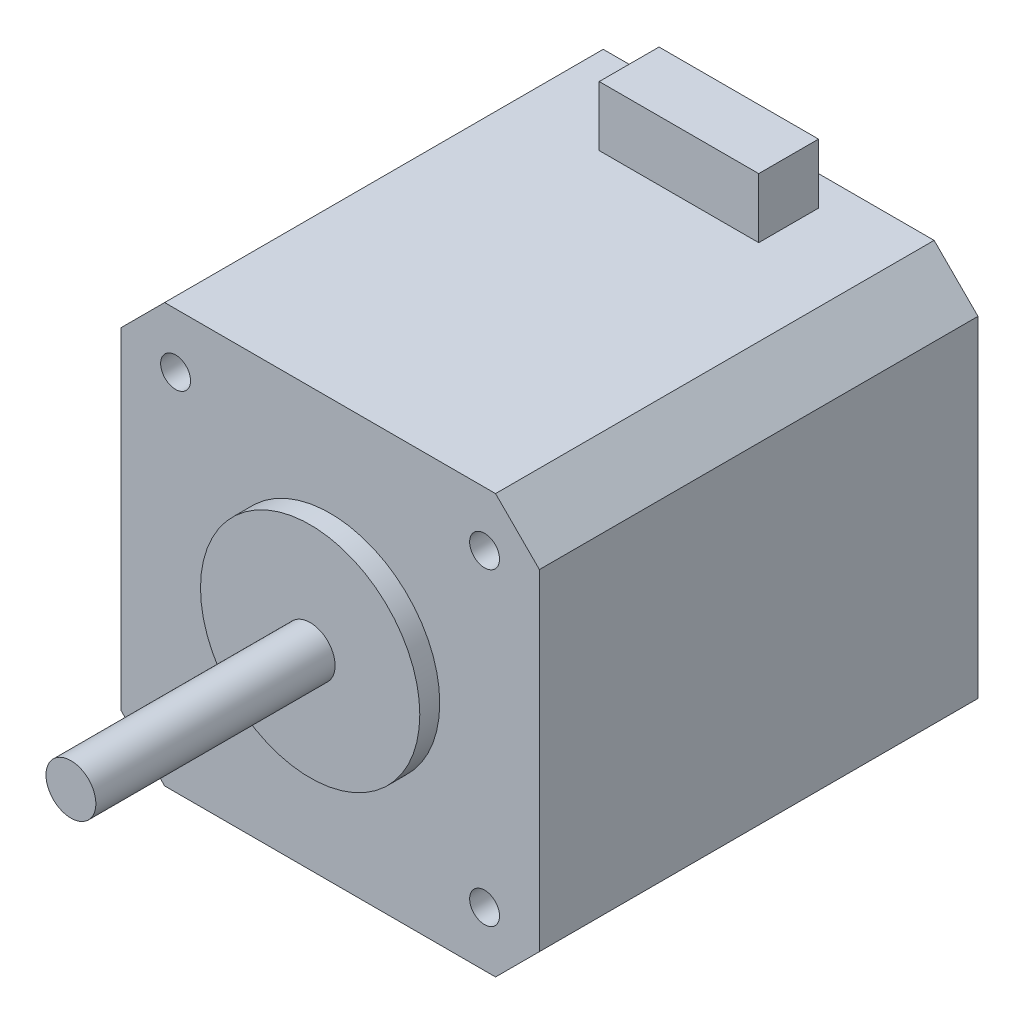
ISO-10303-21;
HEADER;
FILE_DESCRIPTION(('STEP AP214'),'2;1');
FILE_NAME('part.step','',(''),(''),'','','');
FILE_SCHEMA(('AUTOMOTIVE_DESIGN { 1 0 10303 214 1 1 1 1 }'));
ENDSEC;
DATA;
#1=APPLICATION_CONTEXT('core data for automotive mechanical design processes');
#2=APPLICATION_PROTOCOL_DEFINITION('international standard','automotive_design',2000,#1);
#3=PRODUCT_CONTEXT('',#1,'mechanical');
#4=PRODUCT('Part','Part','',(#3));
#5=PRODUCT_RELATED_PRODUCT_CATEGORY('part','',(#4));
#6=PRODUCT_DEFINITION_FORMATION('','',#4);
#7=PRODUCT_DEFINITION_CONTEXT('part definition',#1,'design');
#8=PRODUCT_DEFINITION('design','',#6,#7);
#9=PRODUCT_DEFINITION_SHAPE('','',#8);
#10=(LENGTH_UNIT() NAMED_UNIT(*) SI_UNIT(.MILLI.,.METRE.));
#11=(NAMED_UNIT(*) PLANE_ANGLE_UNIT() SI_UNIT($,.RADIAN.));
#12=(NAMED_UNIT(*) SI_UNIT($,.STERADIAN.) SOLID_ANGLE_UNIT());
#13=UNCERTAINTY_MEASURE_WITH_UNIT(LENGTH_MEASURE(1.E-05),#10,'distance_accuracy_value','');
#14=(GEOMETRIC_REPRESENTATION_CONTEXT(3) GLOBAL_UNCERTAINTY_ASSIGNED_CONTEXT((#13)) GLOBAL_UNIT_ASSIGNED_CONTEXT((#10,
#11,#12)) REPRESENTATION_CONTEXT('',''));
#15=CARTESIAN_POINT('',(0.,0.,0.));
#16=DIRECTION('',(0.,0.,1.));
#17=DIRECTION('',(1.,0.,0.));
#18=AXIS2_PLACEMENT_3D('',#15,#16,#17);
#19=CARTESIAN_POINT('',(0.,0.,44.));
#20=DIRECTION('',(0.,0.,1.));
#21=DIRECTION('',(1.,0.,0.));
#22=AXIS2_PLACEMENT_3D('',#19,#20,#21);
#23=PLANE('',#22);
#24=CARTESIAN_POINT('',(0.,0.,44.));
#25=DIRECTION('',(0.,0.,1.));
#26=DIRECTION('',(1.,0.,0.));
#27=AXIS2_PLACEMENT_3D('',#24,#25,#26);
#28=CIRCLE('',#27,11.);
#29=CARTESIAN_POINT('',(11.,0.,44.));
#30=VERTEX_POINT('',#29);
#31=EDGE_CURVE('E224',#30,#30,#28,.T.);
#32=ORIENTED_EDGE('',*,*,#31,.F.);
#33=EDGE_LOOP('',(#32));
#34=FACE_BOUND('',#33,.T.);
#35=CARTESIAN_POINT('',(-15.5000000000001,-15.4999999999999,44.));
#36=DIRECTION('',(0.,0.,1.));
#37=DIRECTION('',(1.,0.,0.));
#38=AXIS2_PLACEMENT_3D('',#35,#36,#37);
#39=CIRCLE('',#38,1.5);
#40=CARTESIAN_POINT('',(-14.0000000000001,-15.4999999999999,44.));
#41=VERTEX_POINT('',#40);
#42=EDGE_CURVE('E209',#41,#41,#39,.T.);
#43=ORIENTED_EDGE('',*,*,#42,.F.);
#44=EDGE_LOOP('',(#43));
#45=FACE_BOUND('',#44,.T.);
#46=CARTESIAN_POINT('',(15.5,15.5,44.));
#47=DIRECTION('',(0.,0.,1.));
#48=DIRECTION('',(1.,0.,0.));
#49=AXIS2_PLACEMENT_3D('',#46,#47,#48);
#50=CIRCLE('',#49,1.5);
#51=CARTESIAN_POINT('',(17.,15.5,44.));
#52=VERTEX_POINT('',#51);
#53=EDGE_CURVE('E149',#52,#52,#50,.T.);
#54=ORIENTED_EDGE('',*,*,#53,.F.);
#55=EDGE_LOOP('',(#54));
#56=FACE_BOUND('',#55,.T.);
#57=DIRECTION('',(0.,1.,0.));
#58=VECTOR('',#57,1.);
#59=CARTESIAN_POINT('',(20.9999999999999,-16.6000000000001,44.));
#60=LINE('',#59,#58);
#61=CARTESIAN_POINT('',(20.9999999999999,-16.6000000000001,44.));
#62=VERTEX_POINT('',#61);
#63=CARTESIAN_POINT('',(21.,16.6,44.));
#64=VERTEX_POINT('',#63);
#65=EDGE_CURVE('E101',#62,#64,#60,.T.);
#66=ORIENTED_EDGE('',*,*,#65,.T.);
#67=DIRECTION('',(-0.707106781186548,0.707106781186548,0.));
#68=VECTOR('',#67,1.);
#69=CARTESIAN_POINT('',(21.,16.6,44.));
#70=LINE('',#69,#68);
#71=CARTESIAN_POINT('',(16.6,21.,44.));
#72=VERTEX_POINT('',#71);
#73=EDGE_CURVE('E184',#64,#72,#70,.T.);
#74=ORIENTED_EDGE('',*,*,#73,.T.);
#75=DIRECTION('',(-1.,0.,0.));
#76=VECTOR('',#75,1.);
#77=CARTESIAN_POINT('',(16.6,21.,44.));
#78=LINE('',#77,#76);
#79=CARTESIAN_POINT('',(-16.5999999999998,21.0000000000002,44.));
#80=VERTEX_POINT('',#79);
#81=EDGE_CURVE('E180',#72,#80,#78,.T.);
#82=ORIENTED_EDGE('',*,*,#81,.T.);
#83=DIRECTION('',(-0.707106781186555,-0.70710678118654,0.));
#84=VECTOR('',#83,1.);
#85=CARTESIAN_POINT('',(-16.5999999999998,21.0000000000002,44.));
#86=LINE('',#85,#84);
#87=CARTESIAN_POINT('',(-20.9999999999998,16.6000000000002,44.));
#88=VERTEX_POINT('',#87);
#89=EDGE_CURVE('E194',#80,#88,#86,.T.);
#90=ORIENTED_EDGE('',*,*,#89,.T.);
#91=DIRECTION('',(0.,-1.,0.));
#92=VECTOR('',#91,1.);
#93=CARTESIAN_POINT('',(-20.9999999999998,16.6000000000002,44.));
#94=LINE('',#93,#92);
#95=CARTESIAN_POINT('',(-21.0000000000001,-16.5999999999999,44.));
#96=VERTEX_POINT('',#95);
#97=EDGE_CURVE('E125',#88,#96,#94,.T.);
#98=ORIENTED_EDGE('',*,*,#97,.T.);
#99=DIRECTION('',(0.707106781186542,-0.707106781186553,0.));
#100=VECTOR('',#99,1.);
#101=CARTESIAN_POINT('',(-21.0000000000001,-16.5999999999999,44.));
#102=LINE('',#101,#100);
#103=CARTESIAN_POINT('',(-16.6000000000002,-20.9999999999999,44.));
#104=VERTEX_POINT('',#103);
#105=EDGE_CURVE('E118',#96,#104,#102,.T.);
#106=ORIENTED_EDGE('',*,*,#105,.T.);
#107=DIRECTION('',(1.,0.,0.));
#108=VECTOR('',#107,1.);
#109=CARTESIAN_POINT('',(-16.6000000000002,-20.9999999999999,44.));
#110=LINE('',#109,#108);
#111=CARTESIAN_POINT('',(16.5999999999999,-21.0000000000001,44.));
#112=VERTEX_POINT('',#111);
#113=EDGE_CURVE('E122',#104,#112,#110,.T.);
#114=ORIENTED_EDGE('',*,*,#113,.T.);
#115=DIRECTION('',(0.70710678118655,0.707106781186545,0.));
#116=VECTOR('',#115,1.);
#117=CARTESIAN_POINT('',(16.5999999999999,-21.0000000000001,44.));
#118=LINE('',#117,#116);
#119=EDGE_CURVE('E62',#112,#62,#118,.T.);
#120=ORIENTED_EDGE('',*,*,#119,.T.);
#121=EDGE_LOOP('',(#66,#74,#82,#90,#98,#106,#114,#120));
#122=FACE_BOUND('',#121,.T.);
#123=CARTESIAN_POINT('',(15.4999999999999,-15.5000000000001,44.));
#124=DIRECTION('',(0.,0.,1.));
#125=DIRECTION('',(1.,0.,0.));
#126=AXIS2_PLACEMENT_3D('',#123,#124,#125);
#127=CIRCLE('',#126,1.5);
#128=CARTESIAN_POINT('',(16.9999999999999,-15.5000000000001,44.));
#129=VERTEX_POINT('',#128);
#130=EDGE_CURVE('E203',#129,#129,#127,.T.);
#131=ORIENTED_EDGE('',*,*,#130,.F.);
#132=EDGE_LOOP('',(#131));
#133=FACE_BOUND('',#132,.T.);
#134=CARTESIAN_POINT('',(-15.4999999999998,15.5000000000002,44.));
#135=DIRECTION('',(0.,0.,1.));
#136=DIRECTION('',(1.,0.,0.));
#137=AXIS2_PLACEMENT_3D('',#134,#135,#136);
#138=CIRCLE('',#137,1.5);
#139=CARTESIAN_POINT('',(-13.9999999999998,15.5000000000002,44.));
#140=VERTEX_POINT('',#139);
#141=EDGE_CURVE('E215',#140,#140,#138,.T.);
#142=ORIENTED_EDGE('',*,*,#141,.F.);
#143=EDGE_LOOP('',(#142));
#144=FACE_BOUND('',#143,.T.);
#145=ADVANCED_FACE('F37',(#34,#45,#56,#122,#133,#144),#23,.T.);
#146=CARTESIAN_POINT('',(0.,0.,0.));
#147=DIRECTION('',(0.,0.,1.));
#148=DIRECTION('',(1.,0.,0.));
#149=AXIS2_PLACEMENT_3D('',#146,#147,#148);
#150=PLANE('',#149);
#151=DIRECTION('',(0.,1.,0.));
#152=VECTOR('',#151,1.);
#153=CARTESIAN_POINT('',(21.,0.,0.));
#154=LINE('',#153,#152);
#155=CARTESIAN_POINT('',(20.9999999999999,-16.6000000000001,0.));
#156=VERTEX_POINT('',#155);
#157=CARTESIAN_POINT('',(21.,16.6,0.));
#158=VERTEX_POINT('',#157);
#159=EDGE_CURVE('E95',#156,#158,#154,.T.);
#160=ORIENTED_EDGE('',*,*,#159,.F.);
#161=DIRECTION('',(0.70710678118655,0.707106781186545,0.));
#162=VECTOR('',#161,1.);
#163=CARTESIAN_POINT('',(16.5999999999999,-21.0000000000001,0.));
#164=LINE('',#163,#162);
#165=CARTESIAN_POINT('',(16.5999999999999,-21.0000000000001,0.));
#166=VERTEX_POINT('',#165);
#167=EDGE_CURVE('E162',#166,#156,#164,.T.);
#168=ORIENTED_EDGE('',*,*,#167,.F.);
#169=DIRECTION('',(1.,0.,0.));
#170=VECTOR('',#169,1.);
#171=CARTESIAN_POINT('',(0.,-21.,0.));
#172=LINE('',#171,#170);
#173=CARTESIAN_POINT('',(-16.6000000000002,-20.9999999999999,0.));
#174=VERTEX_POINT('',#173);
#175=EDGE_CURVE('E160',#174,#166,#172,.T.);
#176=ORIENTED_EDGE('',*,*,#175,.F.);
#177=DIRECTION('',(0.707106781186542,-0.707106781186553,0.));
#178=VECTOR('',#177,1.);
#179=CARTESIAN_POINT('',(-21.0000000000001,-16.5999999999999,0.));
#180=LINE('',#179,#178);
#181=CARTESIAN_POINT('',(-21.0000000000001,-16.5999999999999,0.));
#182=VERTEX_POINT('',#181);
#183=EDGE_CURVE('E135',#182,#174,#180,.T.);
#184=ORIENTED_EDGE('',*,*,#183,.F.);
#185=DIRECTION('',(0.,-1.,0.));
#186=VECTOR('',#185,1.);
#187=CARTESIAN_POINT('',(-21.,1.46642216231412E-13,0.));
#188=LINE('',#187,#186);
#189=CARTESIAN_POINT('',(-20.9999999999998,16.6000000000002,0.));
#190=VERTEX_POINT('',#189);
#191=EDGE_CURVE('E157',#190,#182,#188,.T.);
#192=ORIENTED_EDGE('',*,*,#191,.F.);
#193=DIRECTION('',(-0.707106781186555,-0.70710678118654,0.));
#194=VECTOR('',#193,1.);
#195=CARTESIAN_POINT('',(-16.5999999999998,21.0000000000002,0.));
#196=LINE('',#195,#194);
#197=CARTESIAN_POINT('',(-16.5999999999998,21.0000000000002,0.));
#198=VERTEX_POINT('',#197);
#199=EDGE_CURVE('E154',#198,#190,#196,.T.);
#200=ORIENTED_EDGE('',*,*,#199,.F.);
#201=DIRECTION('',(-1.,0.,0.));
#202=VECTOR('',#201,1.);
#203=CARTESIAN_POINT('',(0.,21.,0.));
#204=LINE('',#203,#202);
#205=CARTESIAN_POINT('',(16.6,21.,0.));
#206=VERTEX_POINT('',#205);
#207=EDGE_CURVE('E152',#206,#198,#204,.T.);
#208=ORIENTED_EDGE('',*,*,#207,.F.);
#209=DIRECTION('',(-0.707106781186548,0.707106781186548,0.));
#210=VECTOR('',#209,1.);
#211=CARTESIAN_POINT('',(21.,16.6,0.));
#212=LINE('',#211,#210);
#213=EDGE_CURVE('E148',#158,#206,#212,.T.);
#214=ORIENTED_EDGE('',*,*,#213,.F.);
#215=EDGE_LOOP('',(#160,#168,#176,#184,#192,#200,#208,#214));
#216=FACE_BOUND('',#215,.T.);
#217=CARTESIAN_POINT('',(15.5,15.5,0.));
#218=DIRECTION('',(0.,0.,1.));
#219=DIRECTION('',(1.,0.,0.));
#220=AXIS2_PLACEMENT_3D('',#217,#218,#219);
#221=CIRCLE('',#220,1.5);
#222=CARTESIAN_POINT('',(17.,15.5,0.));
#223=VERTEX_POINT('',#222);
#224=EDGE_CURVE('E200',#223,#223,#221,.T.);
#225=ORIENTED_EDGE('',*,*,#224,.T.);
#226=EDGE_LOOP('',(#225));
#227=FACE_BOUND('',#226,.T.);
#228=CARTESIAN_POINT('',(15.4999999999999,-15.5000000000001,0.));
#229=DIRECTION('',(0.,0.,1.));
#230=DIRECTION('',(1.,0.,0.));
#231=AXIS2_PLACEMENT_3D('',#228,#229,#230);
#232=CIRCLE('',#231,1.5);
#233=CARTESIAN_POINT('',(16.9999999999999,-15.5000000000001,0.));
#234=VERTEX_POINT('',#233);
#235=EDGE_CURVE('E206',#234,#234,#232,.T.);
#236=ORIENTED_EDGE('',*,*,#235,.T.);
#237=EDGE_LOOP('',(#236));
#238=FACE_BOUND('',#237,.T.);
#239=CARTESIAN_POINT('',(-15.5000000000001,-15.4999999999999,0.));
#240=DIRECTION('',(0.,0.,1.));
#241=DIRECTION('',(1.,0.,0.));
#242=AXIS2_PLACEMENT_3D('',#239,#240,#241);
#243=CIRCLE('',#242,1.5);
#244=CARTESIAN_POINT('',(-14.0000000000001,-15.4999999999999,0.));
#245=VERTEX_POINT('',#244);
#246=EDGE_CURVE('E212',#245,#245,#243,.T.);
#247=ORIENTED_EDGE('',*,*,#246,.T.);
#248=EDGE_LOOP('',(#247));
#249=FACE_BOUND('',#248,.T.);
#250=CARTESIAN_POINT('',(-15.4999999999998,15.5000000000002,0.));
#251=DIRECTION('',(0.,0.,1.));
#252=DIRECTION('',(1.,0.,0.));
#253=AXIS2_PLACEMENT_3D('',#250,#251,#252);
#254=CIRCLE('',#253,1.5);
#255=CARTESIAN_POINT('',(-13.9999999999998,15.5000000000002,0.));
#256=VERTEX_POINT('',#255);
#257=EDGE_CURVE('E218',#256,#256,#254,.T.);
#258=ORIENTED_EDGE('',*,*,#257,.T.);
#259=EDGE_LOOP('',(#258));
#260=FACE_BOUND('',#259,.T.);
#261=ADVANCED_FACE('F185',(#216,#227,#238,#249,#260),#150,.F.);
#262=CARTESIAN_POINT('',(21.,0.,44.));
#263=DIRECTION('',(-1.,0.,0.));
#264=DIRECTION('',(0.,0.,1.));
#265=AXIS2_PLACEMENT_3D('',#262,#263,#264);
#266=PLANE('',#265);
#267=ORIENTED_EDGE('',*,*,#159,.T.);
#268=DIRECTION('',(0.,0.,-1.));
#269=VECTOR('',#268,1.);
#270=CARTESIAN_POINT('',(21.,16.6,44.));
#271=LINE('',#270,#269);
#272=EDGE_CURVE('E11',#64,#158,#271,.T.);
#273=ORIENTED_EDGE('',*,*,#272,.F.);
#274=ORIENTED_EDGE('',*,*,#65,.F.);
#275=DIRECTION('',(0.,0.,-1.));
#276=VECTOR('',#275,1.);
#277=CARTESIAN_POINT('',(20.9999999999999,-16.6000000000001,44.));
#278=LINE('',#277,#276);
#279=EDGE_CURVE('E143',#62,#156,#278,.T.);
#280=ORIENTED_EDGE('',*,*,#279,.T.);
#281=EDGE_LOOP('',(#267,#273,#274,#280));
#282=FACE_BOUND('',#281,.T.);
#283=ADVANCED_FACE('F39',(#282),#266,.F.);
#284=CARTESIAN_POINT('',(21.,16.6,44.));
#285=DIRECTION('',(-0.707106781186548,-0.707106781186548,0.));
#286=DIRECTION('',(0.707106781186548,-0.707106781186548,0.));
#287=AXIS2_PLACEMENT_3D('',#284,#285,#286);
#288=PLANE('',#287);
#289=ORIENTED_EDGE('',*,*,#213,.T.);
#290=DIRECTION('',(0.,0.,-1.));
#291=VECTOR('',#290,1.);
#292=CARTESIAN_POINT('',(16.6,21.,44.));
#293=LINE('',#292,#291);
#294=EDGE_CURVE('E46',#72,#206,#293,.T.);
#295=ORIENTED_EDGE('',*,*,#294,.F.);
#296=ORIENTED_EDGE('',*,*,#73,.F.);
#297=ORIENTED_EDGE('',*,*,#272,.T.);
#298=EDGE_LOOP('',(#289,#295,#296,#297));
#299=FACE_BOUND('',#298,.T.);
#300=ADVANCED_FACE('F183',(#299),#288,.F.);
#301=CARTESIAN_POINT('',(0.,21.,44.));
#302=DIRECTION('',(0.,-1.,0.));
#303=DIRECTION('',(1.,0.,0.));
#304=AXIS2_PLACEMENT_3D('',#301,#302,#303);
#305=PLANE('',#304);
#306=DIRECTION('',(0.,0.,-1.));
#307=VECTOR('',#306,1.);
#308=CARTESIAN_POINT('',(-7.99999999999978,21.0000000000001,9.));
#309=LINE('',#308,#307);
#310=CARTESIAN_POINT('',(-7.99999999999978,21.0000000000001,9.));
#311=VERTEX_POINT('',#310);
#312=CARTESIAN_POINT('',(-7.99999999999978,21.0000000000001,3.));
#313=VERTEX_POINT('',#312);
#314=EDGE_CURVE('E243',#311,#313,#309,.T.);
#315=ORIENTED_EDGE('',*,*,#314,.T.);
#316=DIRECTION('',(1.,0.,0.));
#317=VECTOR('',#316,1.);
#318=CARTESIAN_POINT('',(-7.99999999999978,21.0000000000001,3.));
#319=LINE('',#318,#317);
#320=CARTESIAN_POINT('',(8.00000000000022,20.9999999999999,3.));
#321=VERTEX_POINT('',#320);
#322=EDGE_CURVE('E251',#313,#321,#319,.T.);
#323=ORIENTED_EDGE('',*,*,#322,.T.);
#324=DIRECTION('',(0.,0.,1.));
#325=VECTOR('',#324,1.);
#326=CARTESIAN_POINT('',(8.00000000000022,20.9999999999999,3.));
#327=LINE('',#326,#325);
#328=CARTESIAN_POINT('',(8.00000000000022,20.9999999999999,8.99999999999999));
#329=VERTEX_POINT('',#328);
#330=EDGE_CURVE('E248',#321,#329,#327,.T.);
#331=ORIENTED_EDGE('',*,*,#330,.T.);
#332=DIRECTION('',(1.,0.,0.));
#333=VECTOR('',#332,1.);
#334=CARTESIAN_POINT('',(-7.99999999999978,21.0000000000001,9.));
#335=LINE('',#334,#333);
#336=EDGE_CURVE('E53',#311,#329,#335,.T.);
#337=ORIENTED_EDGE('',*,*,#336,.F.);
#338=EDGE_LOOP('',(#315,#323,#331,#337));
#339=FACE_BOUND('',#338,.T.);
#340=ORIENTED_EDGE('',*,*,#207,.T.);
#341=DIRECTION('',(0.,0.,-1.));
#342=VECTOR('',#341,1.);
#343=CARTESIAN_POINT('',(-16.5999999999998,21.0000000000002,44.));
#344=LINE('',#343,#342);
#345=EDGE_CURVE('E171',#80,#198,#344,.T.);
#346=ORIENTED_EDGE('',*,*,#345,.F.);
#347=ORIENTED_EDGE('',*,*,#81,.F.);
#348=ORIENTED_EDGE('',*,*,#294,.T.);
#349=EDGE_LOOP('',(#340,#346,#347,#348));
#350=FACE_BOUND('',#349,.T.);
#351=ADVANCED_FACE('F178',(#339,#350),#305,.F.);
#352=CARTESIAN_POINT('',(-16.5999999999998,21.0000000000002,44.));
#353=DIRECTION('',(0.70710678118654,-0.707106781186555,0.));
#354=DIRECTION('',(0.707106781186555,0.70710678118654,0.));
#355=AXIS2_PLACEMENT_3D('',#352,#353,#354);
#356=PLANE('',#355);
#357=ORIENTED_EDGE('',*,*,#199,.T.);
#358=DIRECTION('',(0.,0.,-1.));
#359=VECTOR('',#358,1.);
#360=CARTESIAN_POINT('',(-20.9999999999998,16.6000000000002,44.));
#361=LINE('',#360,#359);
#362=EDGE_CURVE('E168',#88,#190,#361,.T.);
#363=ORIENTED_EDGE('',*,*,#362,.F.);
#364=ORIENTED_EDGE('',*,*,#89,.F.);
#365=ORIENTED_EDGE('',*,*,#345,.T.);
#366=EDGE_LOOP('',(#357,#363,#364,#365));
#367=FACE_BOUND('',#366,.T.);
#368=ADVANCED_FACE('F190',(#367),#356,.F.);
#369=CARTESIAN_POINT('',(-21.,1.46642216231412E-13,44.));
#370=DIRECTION('',(1.,0.,0.));
#371=DIRECTION('',(0.,1.,0.));
#372=AXIS2_PLACEMENT_3D('',#369,#370,#371);
#373=PLANE('',#372);
#374=ORIENTED_EDGE('',*,*,#191,.T.);
#375=DIRECTION('',(0.,0.,-1.));
#376=VECTOR('',#375,1.);
#377=CARTESIAN_POINT('',(-21.0000000000001,-16.5999999999999,44.));
#378=LINE('',#377,#376);
#379=EDGE_CURVE('E137',#96,#182,#378,.T.);
#380=ORIENTED_EDGE('',*,*,#379,.F.);
#381=ORIENTED_EDGE('',*,*,#97,.F.);
#382=ORIENTED_EDGE('',*,*,#362,.T.);
#383=EDGE_LOOP('',(#374,#380,#381,#382));
#384=FACE_BOUND('',#383,.T.);
#385=ADVANCED_FACE('F193',(#384),#373,.F.);
#386=CARTESIAN_POINT('',(-21.0000000000001,-16.5999999999999,44.));
#387=DIRECTION('',(0.707106781186553,0.707106781186542,0.));
#388=DIRECTION('',(-0.707106781186542,0.707106781186553,0.));
#389=AXIS2_PLACEMENT_3D('',#386,#387,#388);
#390=PLANE('',#389);
#391=ORIENTED_EDGE('',*,*,#183,.T.);
#392=DIRECTION('',(0.,0.,-1.));
#393=VECTOR('',#392,1.);
#394=CARTESIAN_POINT('',(-16.6000000000002,-20.9999999999999,44.));
#395=LINE('',#394,#393);
#396=EDGE_CURVE('E132',#104,#174,#395,.T.);
#397=ORIENTED_EDGE('',*,*,#396,.F.);
#398=ORIENTED_EDGE('',*,*,#105,.F.);
#399=ORIENTED_EDGE('',*,*,#379,.T.);
#400=EDGE_LOOP('',(#391,#397,#398,#399));
#401=FACE_BOUND('',#400,.T.);
#402=ADVANCED_FACE('F133',(#401),#390,.F.);
#403=CARTESIAN_POINT('',(0.,-21.,44.));
#404=DIRECTION('',(0.,1.,0.));
#405=DIRECTION('',(-1.,0.,0.));
#406=AXIS2_PLACEMENT_3D('',#403,#404,#405);
#407=PLANE('',#406);
#408=ORIENTED_EDGE('',*,*,#175,.T.);
#409=DIRECTION('',(0.,0.,-1.));
#410=VECTOR('',#409,1.);
#411=CARTESIAN_POINT('',(16.5999999999999,-21.0000000000001,44.));
#412=LINE('',#411,#410);
#413=EDGE_CURVE('E138',#112,#166,#412,.T.);
#414=ORIENTED_EDGE('',*,*,#413,.F.);
#415=ORIENTED_EDGE('',*,*,#113,.F.);
#416=ORIENTED_EDGE('',*,*,#396,.T.);
#417=EDGE_LOOP('',(#408,#414,#415,#416));
#418=FACE_BOUND('',#417,.T.);
#419=ADVANCED_FACE('F140',(#418),#407,.F.);
#420=CARTESIAN_POINT('',(16.5999999999999,-21.0000000000001,44.));
#421=DIRECTION('',(-0.707106781186545,0.70710678118655,0.));
#422=DIRECTION('',(-0.70710678118655,-0.707106781186545,0.));
#423=AXIS2_PLACEMENT_3D('',#420,#421,#422);
#424=PLANE('',#423);
#425=ORIENTED_EDGE('',*,*,#167,.T.);
#426=ORIENTED_EDGE('',*,*,#279,.F.);
#427=ORIENTED_EDGE('',*,*,#119,.F.);
#428=ORIENTED_EDGE('',*,*,#413,.T.);
#429=EDGE_LOOP('',(#425,#426,#427,#428));
#430=FACE_BOUND('',#429,.T.);
#431=ADVANCED_FACE('F313',(#430),#424,.F.);
#432=CARTESIAN_POINT('',(15.5,15.5,44.));
#433=DIRECTION('',(0.,0.,-1.));
#434=DIRECTION('',(-1.,0.,0.));
#435=AXIS2_PLACEMENT_3D('',#432,#433,#434);
#436=CYLINDRICAL_SURFACE('',#435,1.5);
#437=ORIENTED_EDGE('',*,*,#53,.T.);
#438=EDGE_LOOP('',(#437));
#439=FACE_BOUND('',#438,.T.);
#440=ORIENTED_EDGE('',*,*,#224,.F.);
#441=EDGE_LOOP('',(#440));
#442=FACE_BOUND('',#441,.T.);
#443=ADVANCED_FACE('F310',(#439,#442),#436,.F.);
#444=CARTESIAN_POINT('',(15.4999999999999,-15.5000000000001,44.));
#445=DIRECTION('',(0.,0.,-1.));
#446=DIRECTION('',(-1.,0.,0.));
#447=AXIS2_PLACEMENT_3D('',#444,#445,#446);
#448=CYLINDRICAL_SURFACE('',#447,1.5);
#449=ORIENTED_EDGE('',*,*,#130,.T.);
#450=EDGE_LOOP('',(#449));
#451=FACE_BOUND('',#450,.T.);
#452=ORIENTED_EDGE('',*,*,#235,.F.);
#453=EDGE_LOOP('',(#452));
#454=FACE_BOUND('',#453,.T.);
#455=ADVANCED_FACE('F344',(#451,#454),#448,.F.);
#456=CARTESIAN_POINT('',(-15.5000000000001,-15.4999999999999,44.));
#457=DIRECTION('',(0.,0.,-1.));
#458=DIRECTION('',(-1.,0.,0.));
#459=AXIS2_PLACEMENT_3D('',#456,#457,#458);
#460=CYLINDRICAL_SURFACE('',#459,1.5);
#461=ORIENTED_EDGE('',*,*,#42,.T.);
#462=EDGE_LOOP('',(#461));
#463=FACE_BOUND('',#462,.T.);
#464=ORIENTED_EDGE('',*,*,#246,.F.);
#465=EDGE_LOOP('',(#464));
#466=FACE_BOUND('',#465,.T.);
#467=ADVANCED_FACE('F351',(#463,#466),#460,.F.);
#468=CARTESIAN_POINT('',(-15.4999999999998,15.5000000000002,44.));
#469=DIRECTION('',(0.,0.,-1.));
#470=DIRECTION('',(-1.,0.,0.));
#471=AXIS2_PLACEMENT_3D('',#468,#469,#470);
#472=CYLINDRICAL_SURFACE('',#471,1.5);
#473=ORIENTED_EDGE('',*,*,#141,.T.);
#474=EDGE_LOOP('',(#473));
#475=FACE_BOUND('',#474,.T.);
#476=ORIENTED_EDGE('',*,*,#257,.F.);
#477=EDGE_LOOP('',(#476));
#478=FACE_BOUND('',#477,.T.);
#479=ADVANCED_FACE('F358',(#475,#478),#472,.F.);
#480=CARTESIAN_POINT('',(0.,0.,46.));
#481=DIRECTION('',(0.,0.,-1.));
#482=DIRECTION('',(-1.,0.,0.));
#483=AXIS2_PLACEMENT_3D('',#480,#481,#482);
#484=CYLINDRICAL_SURFACE('',#483,11.);
#485=CARTESIAN_POINT('',(0.,0.,46.));
#486=DIRECTION('',(0.,0.,1.));
#487=DIRECTION('',(1.,0.,0.));
#488=AXIS2_PLACEMENT_3D('',#485,#486,#487);
#489=CIRCLE('',#488,11.);
#490=CARTESIAN_POINT('',(11.,0.,46.));
#491=VERTEX_POINT('',#490);
#492=EDGE_CURVE('E221',#491,#491,#489,.T.);
#493=ORIENTED_EDGE('',*,*,#492,.F.);
#494=EDGE_LOOP('',(#493));
#495=FACE_BOUND('',#494,.T.);
#496=ORIENTED_EDGE('',*,*,#31,.T.);
#497=EDGE_LOOP('',(#496));
#498=FACE_BOUND('',#497,.T.);
#499=ADVANCED_FACE('F366',(#495,#498),#484,.T.);
#500=CARTESIAN_POINT('',(0.,0.,46.));
#501=DIRECTION('',(0.,0.,1.));
#502=DIRECTION('',(1.,0.,0.));
#503=AXIS2_PLACEMENT_3D('',#500,#501,#502);
#504=PLANE('',#503);
#505=CARTESIAN_POINT('',(0.,0.,46.));
#506=DIRECTION('',(0.,0.,1.));
#507=DIRECTION('',(1.,0.,0.));
#508=AXIS2_PLACEMENT_3D('',#505,#506,#507);
#509=CIRCLE('',#508,2.5);
#510=CARTESIAN_POINT('',(-2.5,0.,46.));
#511=VERTEX_POINT('',#510);
#512=EDGE_CURVE('E41',#511,#511,#509,.F.);
#513=ORIENTED_EDGE('',*,*,#512,.T.);
#514=EDGE_LOOP('',(#513));
#515=FACE_BOUND('',#514,.T.);
#516=ORIENTED_EDGE('',*,*,#492,.T.);
#517=EDGE_LOOP('',(#516));
#518=FACE_BOUND('',#517,.T.);
#519=ADVANCED_FACE('F374',(#515,#518),#504,.T.);
#520=CARTESIAN_POINT('',(0.,0.,70.));
#521=DIRECTION('',(0.,0.,-1.));
#522=DIRECTION('',(-1.,0.,0.));
#523=AXIS2_PLACEMENT_3D('',#520,#521,#522);
#524=CYLINDRICAL_SURFACE('',#523,2.5);
#525=CARTESIAN_POINT('',(0.,0.,70.));
#526=DIRECTION('',(0.,0.,1.));
#527=DIRECTION('',(1.,0.,0.));
#528=AXIS2_PLACEMENT_3D('',#525,#526,#527);
#529=CIRCLE('',#528,2.5);
#530=CARTESIAN_POINT('',(-2.5,0.,70.));
#531=VERTEX_POINT('',#530);
#532=EDGE_CURVE('E229',#531,#531,#529,.T.);
#533=CARTESIAN_POINT('',(-2.5,0.,46.));
#534=CARTESIAN_POINT('',(-2.5,0.,46.25));
#535=CARTESIAN_POINT('',(-2.5,0.,46.5));
#536=CARTESIAN_POINT('',(-2.5,0.,47.));
#537=CARTESIAN_POINT('',(-2.5,0.,47.25));
#538=CARTESIAN_POINT('',(-2.5,0.,47.75));
#539=CARTESIAN_POINT('',(-2.5,0.,48.));
#540=CARTESIAN_POINT('',(-2.5,0.,48.5));
#541=CARTESIAN_POINT('',(-2.5,0.,48.75));
#542=CARTESIAN_POINT('',(-2.5,0.,49.25));
#543=CARTESIAN_POINT('',(-2.5,0.,49.5));
#544=CARTESIAN_POINT('',(-2.5,0.,50.));
#545=CARTESIAN_POINT('',(-2.5,0.,50.25));
#546=CARTESIAN_POINT('',(-2.5,0.,50.75));
#547=CARTESIAN_POINT('',(-2.5,0.,51.));
#548=CARTESIAN_POINT('',(-2.5,0.,51.5));
#549=CARTESIAN_POINT('',(-2.5,0.,51.75));
#550=CARTESIAN_POINT('',(-2.5,0.,52.25));
#551=CARTESIAN_POINT('',(-2.5,0.,52.5));
#552=CARTESIAN_POINT('',(-2.5,0.,53.));
#553=CARTESIAN_POINT('',(-2.5,0.,53.25));
#554=CARTESIAN_POINT('',(-2.5,0.,53.75));
#555=CARTESIAN_POINT('',(-2.5,0.,54.));
#556=CARTESIAN_POINT('',(-2.5,0.,54.5));
#557=CARTESIAN_POINT('',(-2.5,0.,54.75));
#558=CARTESIAN_POINT('',(-2.5,0.,55.25));
#559=CARTESIAN_POINT('',(-2.5,0.,55.5));
#560=CARTESIAN_POINT('',(-2.5,0.,56.));
#561=CARTESIAN_POINT('',(-2.5,0.,56.25));
#562=CARTESIAN_POINT('',(-2.5,0.,56.75));
#563=CARTESIAN_POINT('',(-2.5,0.,57.));
#564=CARTESIAN_POINT('',(-2.5,0.,57.5));
#565=CARTESIAN_POINT('',(-2.5,0.,57.75));
#566=CARTESIAN_POINT('',(-2.5,0.,58.25));
#567=CARTESIAN_POINT('',(-2.5,0.,58.5));
#568=CARTESIAN_POINT('',(-2.5,0.,59.));
#569=CARTESIAN_POINT('',(-2.5,0.,59.25));
#570=CARTESIAN_POINT('',(-2.5,0.,59.75));
#571=CARTESIAN_POINT('',(-2.5,0.,60.));
#572=CARTESIAN_POINT('',(-2.5,0.,60.5));
#573=CARTESIAN_POINT('',(-2.5,0.,60.75));
#574=CARTESIAN_POINT('',(-2.5,0.,61.25));
#575=CARTESIAN_POINT('',(-2.5,0.,61.5));
#576=CARTESIAN_POINT('',(-2.5,0.,62.));
#577=CARTESIAN_POINT('',(-2.5,0.,62.25));
#578=CARTESIAN_POINT('',(-2.5,0.,62.75));
#579=CARTESIAN_POINT('',(-2.5,0.,63.));
#580=CARTESIAN_POINT('',(-2.5,0.,63.5));
#581=CARTESIAN_POINT('',(-2.5,0.,63.75));
#582=CARTESIAN_POINT('',(-2.5,0.,64.25));
#583=CARTESIAN_POINT('',(-2.5,0.,64.5));
#584=CARTESIAN_POINT('',(-2.5,0.,65.));
#585=CARTESIAN_POINT('',(-2.5,0.,65.25));
#586=CARTESIAN_POINT('',(-2.5,0.,65.75));
#587=CARTESIAN_POINT('',(-2.5,0.,66.));
#588=CARTESIAN_POINT('',(-2.5,0.,66.5));
#589=CARTESIAN_POINT('',(-2.5,0.,66.75));
#590=CARTESIAN_POINT('',(-2.5,0.,67.25));
#591=CARTESIAN_POINT('',(-2.5,0.,67.5));
#592=CARTESIAN_POINT('',(-2.5,0.,68.));
#593=CARTESIAN_POINT('',(-2.5,0.,68.25));
#594=CARTESIAN_POINT('',(-2.5,0.,68.75));
#595=CARTESIAN_POINT('',(-2.5,0.,69.));
#596=CARTESIAN_POINT('',(-2.5,0.,69.5));
#597=CARTESIAN_POINT('',(-2.5,0.,69.75));
#598=CARTESIAN_POINT('',(-2.5,0.,70.));
#599=B_SPLINE_CURVE_WITH_KNOTS('',3,(#533,#534,#535,#536,#537,#538,#539,#540,#541,#542,#543,
#544,#545,#546,#547,#548,#549,#550,#551,#552,#553,#554,#555,#556,#557,#558,#559,#560,#561,#562,
#563,#564,#565,#566,#567,#568,#569,#570,#571,#572,#573,#574,#575,#576,#577,#578,#579,#580,#581,
#582,#583,#584,#585,#586,#587,#588,#589,#590,#591,#592,#593,#594,#595,#596,#597,#598),
.UNSPECIFIED.,.F.,.F.,(4,2,2,2,2,2,2,2,2,2,2,2,2,2,2,2,2,2,2,2,2,2,2,2,2,2,2,2,2,2,2,2,4),(0.,
0.750000000000001,1.5,2.25,3.,3.75,4.49999999999999,5.24999999999999,5.99999999999999,
6.74999999999999,7.49999999999999,8.24999999999999,8.99999999999999,9.74999999999999,10.5,11.25,
12.,12.75,13.5,14.25,15.,15.75,16.5,17.25,18.,18.75,19.5,20.25,21.,21.75,22.5,23.25,24.),.UNSPECIFIED.);
#600=EDGE_CURVE('BSEAM382',#511,#531,#599,.T.);
#601=ORIENTED_EDGE('',*,*,#512,.F.);
#602=ORIENTED_EDGE('',*,*,#532,.F.);
#603=ORIENTED_EDGE('',*,*,#600,.T.);
#604=ORIENTED_EDGE('',*,*,#600,.F.);
#605=EDGE_LOOP('',(#601,#603,#602,#604));
#606=FACE_BOUND('',#605,.T.);
#607=ADVANCED_FACE('F382',(#606),#524,.T.);
#608=CARTESIAN_POINT('',(0.,0.,70.));
#609=DIRECTION('',(0.,0.,1.));
#610=DIRECTION('',(1.,0.,0.));
#611=AXIS2_PLACEMENT_3D('',#608,#609,#610);
#612=PLANE('',#611);
#613=ORIENTED_EDGE('',*,*,#532,.T.);
#614=EDGE_LOOP('',(#613));
#615=FACE_BOUND('',#614,.T.);
#616=ADVANCED_FACE('F390',(#615),#612,.T.);
#617=CARTESIAN_POINT('',(-7.99999999999972,27.0000000000001,3.));
#618=DIRECTION('',(0.,0.,-1.));
#619=DIRECTION('',(-1.,0.,0.));
#620=AXIS2_PLACEMENT_3D('',#617,#618,#619);
#621=PLANE('',#620);
#622=ORIENTED_EDGE('',*,*,#322,.F.);
#623=DIRECTION('',(0.,-1.,0.));
#624=VECTOR('',#623,1.);
#625=CARTESIAN_POINT('',(-7.99999999999972,27.0000000000001,3.));
#626=LINE('',#625,#624);
#627=CARTESIAN_POINT('',(-7.99999999999972,27.0000000000001,3.));
#628=VERTEX_POINT('',#627);
#629=EDGE_CURVE('E232',#628,#313,#626,.T.);
#630=ORIENTED_EDGE('',*,*,#629,.F.);
#631=DIRECTION('',(1.,0.,0.));
#632=VECTOR('',#631,1.);
#633=CARTESIAN_POINT('',(-7.99999999999972,27.0000000000001,3.));
#634=LINE('',#633,#632);
#635=CARTESIAN_POINT('',(8.00000000000028,26.9999999999999,3.));
#636=VERTEX_POINT('',#635);
#637=EDGE_CURVE('E246',#628,#636,#634,.T.);
#638=ORIENTED_EDGE('',*,*,#637,.T.);
#639=DIRECTION('',(0.,-1.,0.));
#640=VECTOR('',#639,1.);
#641=CARTESIAN_POINT('',(8.00000000000028,26.9999999999999,3.));
#642=LINE('',#641,#640);
#643=EDGE_CURVE('E233',#636,#321,#642,.T.);
#644=ORIENTED_EDGE('',*,*,#643,.T.);
#645=EDGE_LOOP('',(#622,#630,#638,#644));
#646=FACE_BOUND('',#645,.T.);
#647=ADVANCED_FACE('F268',(#646),#621,.T.);
#648=CARTESIAN_POINT('',(-7.99999999999972,27.0000000000001,9.));
#649=DIRECTION('',(-1.,0.,0.));
#650=DIRECTION('',(0.,-1.,0.));
#651=AXIS2_PLACEMENT_3D('',#648,#649,#650);
#652=PLANE('',#651);
#653=ORIENTED_EDGE('',*,*,#314,.F.);
#654=DIRECTION('',(0.,-1.,0.));
#655=VECTOR('',#654,1.);
#656=CARTESIAN_POINT('',(-7.99999999999972,27.0000000000001,9.));
#657=LINE('',#656,#655);
#658=CARTESIAN_POINT('',(-7.99999999999972,27.0000000000001,9.));
#659=VERTEX_POINT('',#658);
#660=EDGE_CURVE('E239',#659,#311,#657,.T.);
#661=ORIENTED_EDGE('',*,*,#660,.F.);
#662=DIRECTION('',(0.,0.,-1.));
#663=VECTOR('',#662,1.);
#664=CARTESIAN_POINT('',(-7.99999999999972,27.0000000000001,9.));
#665=LINE('',#664,#663);
#666=EDGE_CURVE('E237',#659,#628,#665,.T.);
#667=ORIENTED_EDGE('',*,*,#666,.T.);
#668=ORIENTED_EDGE('',*,*,#629,.T.);
#669=EDGE_LOOP('',(#653,#661,#667,#668));
#670=FACE_BOUND('',#669,.T.);
#671=ADVANCED_FACE('F283',(#670),#652,.T.);
#672=CARTESIAN_POINT('',(-7.99999999999972,27.0000000000001,9.));
#673=DIRECTION('',(0.,0.,-1.));
#674=DIRECTION('',(-1.,0.,0.));
#675=AXIS2_PLACEMENT_3D('',#672,#673,#674);
#676=PLANE('',#675);
#677=ORIENTED_EDGE('',*,*,#336,.T.);
#678=DIRECTION('',(0.,-1.,0.));
#679=VECTOR('',#678,1.);
#680=CARTESIAN_POINT('',(8.00000000000028,26.9999999999999,9.));
#681=LINE('',#680,#679);
#682=CARTESIAN_POINT('',(8.00000000000028,26.9999999999999,9.));
#683=VERTEX_POINT('',#682);
#684=EDGE_CURVE('E236',#683,#329,#681,.T.);
#685=ORIENTED_EDGE('',*,*,#684,.F.);
#686=DIRECTION('',(1.,0.,0.));
#687=VECTOR('',#686,1.);
#688=CARTESIAN_POINT('',(-7.99999999999972,27.0000000000001,9.));
#689=LINE('',#688,#687);
#690=EDGE_CURVE('E256',#659,#683,#689,.T.);
#691=ORIENTED_EDGE('',*,*,#690,.F.);
#692=ORIENTED_EDGE('',*,*,#660,.T.);
#693=EDGE_LOOP('',(#677,#685,#691,#692));
#694=FACE_BOUND('',#693,.T.);
#695=ADVANCED_FACE('F287',(#694),#676,.F.);
#696=CARTESIAN_POINT('',(8.00000000000028,26.9999999999999,3.));
#697=DIRECTION('',(1.,0.,0.));
#698=DIRECTION('',(0.,1.,0.));
#699=AXIS2_PLACEMENT_3D('',#696,#697,#698);
#700=PLANE('',#699);
#701=ORIENTED_EDGE('',*,*,#330,.F.);
#702=ORIENTED_EDGE('',*,*,#643,.F.);
#703=DIRECTION('',(0.,0.,1.));
#704=VECTOR('',#703,1.);
#705=CARTESIAN_POINT('',(8.00000000000028,26.9999999999999,3.));
#706=LINE('',#705,#704);
#707=EDGE_CURVE('E259',#636,#683,#706,.T.);
#708=ORIENTED_EDGE('',*,*,#707,.T.);
#709=ORIENTED_EDGE('',*,*,#684,.T.);
#710=EDGE_LOOP('',(#701,#702,#708,#709));
#711=FACE_BOUND('',#710,.T.);
#712=ADVANCED_FACE('F291',(#711),#700,.T.);
#713=CARTESIAN_POINT('',(2.81276006502361E-13,27.,0.));
#714=DIRECTION('',(0.,-1.,0.));
#715=DIRECTION('',(1.,0.,0.));
#716=AXIS2_PLACEMENT_3D('',#713,#714,#715);
#717=PLANE('',#716);
#718=ORIENTED_EDGE('',*,*,#637,.F.);
#719=ORIENTED_EDGE('',*,*,#666,.F.);
#720=ORIENTED_EDGE('',*,*,#690,.T.);
#721=ORIENTED_EDGE('',*,*,#707,.F.);
#722=EDGE_LOOP('',(#718,#719,#720,#721));
#723=FACE_BOUND('',#722,.T.);
#724=ADVANCED_FACE('F277',(#723),#717,.F.);
#725=CLOSED_SHELL('',(#145,#261,#283,#300,#351,#368,#385,#402,#419,#431,#443,#455,#467,#479,
#499,#519,#607,#616,#647,#671,#695,#712,#724));
#726=MANIFOLD_SOLID_BREP('B2',#725);
#727=ADVANCED_BREP_SHAPE_REPRESENTATION('',(#18,#726),#14);
#728=SHAPE_DEFINITION_REPRESENTATION(#9,#727);
ENDSEC;
END-ISO-10303-21;
